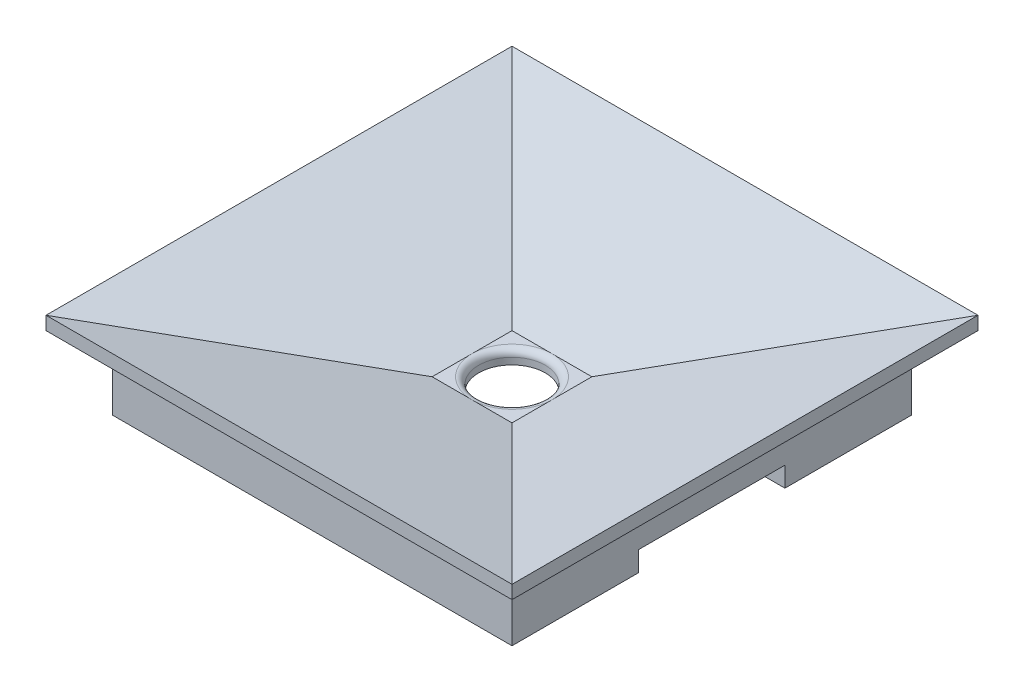
ISO-10303-21;
HEADER;
FILE_DESCRIPTION(('STEP AP214'),'2;1');
FILE_NAME('part.step','',(''),(''),'','','');
FILE_SCHEMA(('AUTOMOTIVE_DESIGN { 1 0 10303 214 1 1 1 1 }'));
ENDSEC;
DATA;
#1=APPLICATION_CONTEXT('core data for automotive mechanical design processes');
#2=APPLICATION_PROTOCOL_DEFINITION('international standard','automotive_design',2000,#1);
#3=PRODUCT_CONTEXT('',#1,'mechanical');
#4=PRODUCT('Part','Part','',(#3));
#5=PRODUCT_RELATED_PRODUCT_CATEGORY('part','',(#4));
#6=PRODUCT_DEFINITION_FORMATION('','',#4);
#7=PRODUCT_DEFINITION_CONTEXT('part definition',#1,'design');
#8=PRODUCT_DEFINITION('design','',#6,#7);
#9=PRODUCT_DEFINITION_SHAPE('','',#8);
#10=(LENGTH_UNIT() NAMED_UNIT(*) SI_UNIT(.MILLI.,.METRE.));
#11=(NAMED_UNIT(*) PLANE_ANGLE_UNIT() SI_UNIT($,.RADIAN.));
#12=(NAMED_UNIT(*) SI_UNIT($,.STERADIAN.) SOLID_ANGLE_UNIT());
#13=UNCERTAINTY_MEASURE_WITH_UNIT(LENGTH_MEASURE(1.E-05),#10,'distance_accuracy_value','');
#14=(GEOMETRIC_REPRESENTATION_CONTEXT(3) GLOBAL_UNCERTAINTY_ASSIGNED_CONTEXT((#13)) GLOBAL_UNIT_ASSIGNED_CONTEXT((#10,
#11,#12)) REPRESENTATION_CONTEXT('',''));
#15=CARTESIAN_POINT('',(0.,0.,0.));
#16=DIRECTION('',(0.,0.,1.));
#17=DIRECTION('',(1.,0.,0.));
#18=AXIS2_PLACEMENT_3D('',#15,#16,#17);
#19=CARTESIAN_POINT('',(0.,5.,0.));
#20=DIRECTION('',(0.,-1.,0.));
#21=DIRECTION('',(0.,0.,-1.));
#22=AXIS2_PLACEMENT_3D('',#19,#20,#21);
#23=PLANE('',#22);
#24=DIRECTION('',(1.,0.,0.));
#25=VECTOR('',#24,1.);
#26=CARTESIAN_POINT('',(0.,5.,-6.));
#27=LINE('',#26,#25);
#28=CARTESIAN_POINT('',(6.,5.,-6.));
#29=VERTEX_POINT('',#28);
#30=CARTESIAN_POINT('',(0.,5.,-6.));
#31=VERTEX_POINT('',#30);
#32=EDGE_CURVE('E345',#29,#31,#27,.F.);
#33=ORIENTED_EDGE('',*,*,#32,.T.);
#34=CARTESIAN_POINT('',(0.,5.,0.));
#35=DIRECTION('',(0.,-1.,0.));
#36=DIRECTION('',(0.,0.,-1.));
#37=AXIS2_PLACEMENT_3D('',#34,#35,#36);
#38=CIRCLE('',#37,6.);
#39=CARTESIAN_POINT('',(6.,5.,0.));
#40=VERTEX_POINT('',#39);
#41=EDGE_CURVE('E60',#31,#40,#38,.T.);
#42=ORIENTED_EDGE('',*,*,#41,.T.);
#43=DIRECTION('',(0.,0.,-1.));
#44=VECTOR('',#43,1.);
#45=CARTESIAN_POINT('',(6.,5.,0.));
#46=LINE('',#45,#44);
#47=EDGE_CURVE('E335',#40,#29,#46,.T.);
#48=ORIENTED_EDGE('',*,*,#47,.T.);
#49=EDGE_LOOP('',(#33,#42,#48));
#50=FACE_BOUND('',#49,.T.);
#51=ADVANCED_FACE('F51',(#50),#23,.F.);
#52=CARTESIAN_POINT('',(6.,5.,6.));
#53=VERTEX_POINT('',#52);
#54=EDGE_CURVE('E331',#53,#40,#46,.T.);
#55=ORIENTED_EDGE('',*,*,#54,.T.);
#56=CARTESIAN_POINT('',(0.,5.,0.));
#57=DIRECTION('',(0.,-1.,0.));
#58=DIRECTION('',(0.,0.,-1.));
#59=AXIS2_PLACEMENT_3D('',#56,#57,#58);
#60=CIRCLE('',#59,6.);
#61=CARTESIAN_POINT('',(0.,5.,6.));
#62=VERTEX_POINT('',#61);
#63=EDGE_CURVE('E67',#40,#62,#60,.T.);
#64=ORIENTED_EDGE('',*,*,#63,.T.);
#65=DIRECTION('',(1.,0.,0.));
#66=VECTOR('',#65,1.);
#67=CARTESIAN_POINT('',(0.,5.,6.));
#68=LINE('',#67,#66);
#69=EDGE_CURVE('E339',#62,#53,#68,.T.);
#70=ORIENTED_EDGE('',*,*,#69,.T.);
#71=EDGE_LOOP('',(#55,#64,#70));
#72=FACE_BOUND('',#71,.T.);
#73=ADVANCED_FACE('F421',(#72),#23,.F.);
#74=CARTESIAN_POINT('',(-6.,5.,6.));
#75=VERTEX_POINT('',#74);
#76=EDGE_CURVE('E336',#75,#62,#68,.T.);
#77=ORIENTED_EDGE('',*,*,#76,.T.);
#78=CARTESIAN_POINT('',(0.,5.,0.));
#79=DIRECTION('',(0.,-1.,0.));
#80=DIRECTION('',(0.,0.,-1.));
#81=AXIS2_PLACEMENT_3D('',#78,#79,#80);
#82=CIRCLE('',#81,6.);
#83=CARTESIAN_POINT('',(-6.,5.,0.));
#84=VERTEX_POINT('',#83);
#85=EDGE_CURVE('E75',#62,#84,#82,.T.);
#86=ORIENTED_EDGE('',*,*,#85,.T.);
#87=DIRECTION('',(0.,0.,-1.));
#88=VECTOR('',#87,1.);
#89=CARTESIAN_POINT('',(-6.,5.,0.));
#90=LINE('',#89,#88);
#91=EDGE_CURVE('E344',#84,#75,#90,.F.);
#92=ORIENTED_EDGE('',*,*,#91,.T.);
#93=EDGE_LOOP('',(#77,#86,#92));
#94=FACE_BOUND('',#93,.T.);
#95=ADVANCED_FACE('F693',(#94),#23,.F.);
#96=CARTESIAN_POINT('',(0.,13.,0.));
#97=DIRECTION('',(0.,-1.,0.));
#98=DIRECTION('',(0.,0.,-1.));
#99=AXIS2_PLACEMENT_3D('',#96,#97,#98);
#100=CYLINDRICAL_SURFACE('',#99,5.);
#101=CARTESIAN_POINT('',(0.,4.,0.));
#102=DIRECTION('',(0.,-1.,0.));
#103=DIRECTION('',(0.,0.,-1.));
#104=AXIS2_PLACEMENT_3D('',#101,#102,#103);
#105=CIRCLE('',#104,5.);
#106=CARTESIAN_POINT('',(0.,4.,-5.));
#107=VERTEX_POINT('',#106);
#108=EDGE_CURVE('E13',#107,#107,#105,.F.);
#109=ORIENTED_EDGE('',*,*,#108,.T.);
#110=EDGE_LOOP('',(#109));
#111=FACE_BOUND('',#110,.T.);
#112=CARTESIAN_POINT('',(0.,3.,0.));
#113=DIRECTION('',(0.,-1.,0.));
#114=DIRECTION('',(0.,0.,-1.));
#115=AXIS2_PLACEMENT_3D('',#112,#113,#114);
#116=CIRCLE('',#115,5.);
#117=CARTESIAN_POINT('',(0.,3.,-5.));
#118=VERTEX_POINT('',#117);
#119=EDGE_CURVE('E492',#118,#118,#116,.F.);
#120=ORIENTED_EDGE('',*,*,#119,.F.);
#121=EDGE_LOOP('',(#120));
#122=FACE_BOUND('',#121,.T.);
#123=ADVANCED_FACE('F710',(#111,#122),#100,.F.);
#124=CARTESIAN_POINT('',(-35.,11.,35.));
#125=DIRECTION('',(-1.,0.,0.));
#126=DIRECTION('',(0.,0.,1.));
#127=AXIS2_PLACEMENT_3D('',#124,#125,#126);
#128=PLANE('',#127);
#129=DIRECTION('',(0.,0.,1.));
#130=VECTOR('',#129,1.);
#131=CARTESIAN_POINT('',(-35.,13.,0.));
#132=LINE('',#131,#130);
#133=CARTESIAN_POINT('',(-35.,13.,-35.));
#134=VERTEX_POINT('',#133);
#135=CARTESIAN_POINT('',(-35.,13.,35.));
#136=VERTEX_POINT('',#135);
#137=EDGE_CURVE('E326',#134,#136,#132,.T.);
#138=ORIENTED_EDGE('',*,*,#137,.F.);
#139=DIRECTION('',(0.,1.,0.));
#140=VECTOR('',#139,1.);
#141=CARTESIAN_POINT('',(-35.,11.,-35.));
#142=LINE('',#141,#140);
#143=CARTESIAN_POINT('',(-35.,11.,-35.));
#144=VERTEX_POINT('',#143);
#145=EDGE_CURVE('E300',#144,#134,#142,.T.);
#146=ORIENTED_EDGE('',*,*,#145,.F.);
#147=DIRECTION('',(0.,0.,1.));
#148=VECTOR('',#147,1.);
#149=CARTESIAN_POINT('',(-35.,11.,35.));
#150=LINE('',#149,#148);
#151=CARTESIAN_POINT('',(-35.,11.,35.));
#152=VERTEX_POINT('',#151);
#153=EDGE_CURVE('E317',#144,#152,#150,.T.);
#154=ORIENTED_EDGE('',*,*,#153,.T.);
#155=DIRECTION('',(0.,1.,0.));
#156=VECTOR('',#155,1.);
#157=CARTESIAN_POINT('',(-35.,11.,35.));
#158=LINE('',#157,#156);
#159=EDGE_CURVE('E305',#152,#136,#158,.T.);
#160=ORIENTED_EDGE('',*,*,#159,.T.);
#161=EDGE_LOOP('',(#138,#146,#154,#160));
#162=FACE_BOUND('',#161,.T.);
#163=ADVANCED_FACE('F714',(#162),#128,.T.);
#164=CARTESIAN_POINT('',(35.,11.,-35.));
#165=DIRECTION('',(0.,0.,-1.));
#166=DIRECTION('',(-1.,0.,0.));
#167=AXIS2_PLACEMENT_3D('',#164,#165,#166);
#168=PLANE('',#167);
#169=DIRECTION('',(1.,0.,0.));
#170=VECTOR('',#169,1.);
#171=CARTESIAN_POINT('',(0.,13.,-35.));
#172=LINE('',#171,#170);
#173=CARTESIAN_POINT('',(35.,13.,-35.));
#174=VERTEX_POINT('',#173);
#175=EDGE_CURVE('E313',#174,#134,#172,.F.);
#176=ORIENTED_EDGE('',*,*,#175,.F.);
#177=DIRECTION('',(0.,1.,0.));
#178=VECTOR('',#177,1.);
#179=CARTESIAN_POINT('',(35.,11.,-35.));
#180=LINE('',#179,#178);
#181=CARTESIAN_POINT('',(35.,11.,-35.));
#182=VERTEX_POINT('',#181);
#183=EDGE_CURVE('E296',#182,#174,#180,.T.);
#184=ORIENTED_EDGE('',*,*,#183,.F.);
#185=DIRECTION('',(-1.,0.,0.));
#186=VECTOR('',#185,1.);
#187=CARTESIAN_POINT('',(35.,11.,-35.));
#188=LINE('',#187,#186);
#189=EDGE_CURVE('E309',#182,#144,#188,.T.);
#190=ORIENTED_EDGE('',*,*,#189,.T.);
#191=ORIENTED_EDGE('',*,*,#145,.T.);
#192=EDGE_LOOP('',(#176,#184,#190,#191));
#193=FACE_BOUND('',#192,.T.);
#194=ADVANCED_FACE('F735',(#193),#168,.T.);
#195=CARTESIAN_POINT('',(35.,11.,35.));
#196=DIRECTION('',(1.,0.,0.));
#197=DIRECTION('',(0.,0.,-1.));
#198=AXIS2_PLACEMENT_3D('',#195,#196,#197);
#199=PLANE('',#198);
#200=DIRECTION('',(0.,0.,1.));
#201=VECTOR('',#200,1.);
#202=CARTESIAN_POINT('',(35.,13.,0.));
#203=LINE('',#202,#201);
#204=CARTESIAN_POINT('',(35.,13.,35.));
#205=VERTEX_POINT('',#204);
#206=EDGE_CURVE('E318',#205,#174,#203,.F.);
#207=ORIENTED_EDGE('',*,*,#206,.F.);
#208=DIRECTION('',(0.,1.,0.));
#209=VECTOR('',#208,1.);
#210=CARTESIAN_POINT('',(35.,11.,35.));
#211=LINE('',#210,#209);
#212=CARTESIAN_POINT('',(35.,11.,35.));
#213=VERTEX_POINT('',#212);
#214=EDGE_CURVE('E301',#213,#205,#211,.T.);
#215=ORIENTED_EDGE('',*,*,#214,.F.);
#216=DIRECTION('',(0.,0.,-1.));
#217=VECTOR('',#216,1.);
#218=CARTESIAN_POINT('',(35.,11.,35.));
#219=LINE('',#218,#217);
#220=EDGE_CURVE('E592',#213,#182,#219,.T.);
#221=ORIENTED_EDGE('',*,*,#220,.T.);
#222=ORIENTED_EDGE('',*,*,#183,.T.);
#223=EDGE_LOOP('',(#207,#215,#221,#222));
#224=FACE_BOUND('',#223,.T.);
#225=ADVANCED_FACE('F732',(#224),#199,.T.);
#226=CARTESIAN_POINT('',(35.,11.,35.));
#227=DIRECTION('',(0.,0.,1.));
#228=DIRECTION('',(1.,0.,0.));
#229=AXIS2_PLACEMENT_3D('',#226,#227,#228);
#230=PLANE('',#229);
#231=DIRECTION('',(1.,0.,0.));
#232=VECTOR('',#231,1.);
#233=CARTESIAN_POINT('',(0.,13.,35.));
#234=LINE('',#233,#232);
#235=EDGE_CURVE('E322',#136,#205,#234,.T.);
#236=ORIENTED_EDGE('',*,*,#235,.F.);
#237=ORIENTED_EDGE('',*,*,#159,.F.);
#238=DIRECTION('',(1.,0.,0.));
#239=VECTOR('',#238,1.);
#240=CARTESIAN_POINT('',(35.,11.,35.));
#241=LINE('',#240,#239);
#242=EDGE_CURVE('E588',#152,#213,#241,.T.);
#243=ORIENTED_EDGE('',*,*,#242,.T.);
#244=ORIENTED_EDGE('',*,*,#214,.T.);
#245=EDGE_LOOP('',(#236,#237,#243,#244));
#246=FACE_BOUND('',#245,.T.);
#247=ADVANCED_FACE('F728',(#246),#230,.T.);
#248=CARTESIAN_POINT('',(0.,11.,0.));
#249=DIRECTION('',(0.,1.,0.));
#250=DIRECTION('',(0.,0.,1.));
#251=AXIS2_PLACEMENT_3D('',#248,#249,#250);
#252=PLANE('',#251);
#253=DIRECTION('',(1.,0.,0.));
#254=VECTOR('',#253,1.);
#255=CARTESIAN_POINT('',(-30.,11.,30.));
#256=LINE('',#255,#254);
#257=CARTESIAN_POINT('',(-30.,11.,30.));
#258=VERTEX_POINT('',#257);
#259=CARTESIAN_POINT('',(30.,11.,30.));
#260=VERTEX_POINT('',#259);
#261=EDGE_CURVE('E330',#258,#260,#256,.T.);
#262=ORIENTED_EDGE('',*,*,#261,.T.);
#263=DIRECTION('',(0.,0.,-1.));
#264=VECTOR('',#263,1.);
#265=CARTESIAN_POINT('',(30.,11.,30.));
#266=LINE('',#265,#264);
#267=CARTESIAN_POINT('',(30.,11.,-30.));
#268=VERTEX_POINT('',#267);
#269=EDGE_CURVE('E334',#260,#268,#266,.T.);
#270=ORIENTED_EDGE('',*,*,#269,.T.);
#271=DIRECTION('',(-1.,0.,0.));
#272=VECTOR('',#271,1.);
#273=CARTESIAN_POINT('',(30.,11.,-30.));
#274=LINE('',#273,#272);
#275=CARTESIAN_POINT('',(-30.,11.,-30.));
#276=VERTEX_POINT('',#275);
#277=EDGE_CURVE('E577',#268,#276,#274,.T.);
#278=ORIENTED_EDGE('',*,*,#277,.T.);
#279=DIRECTION('',(0.,0.,1.));
#280=VECTOR('',#279,1.);
#281=CARTESIAN_POINT('',(-30.,11.,-30.));
#282=LINE('',#281,#280);
#283=EDGE_CURVE('E580',#276,#258,#282,.T.);
#284=ORIENTED_EDGE('',*,*,#283,.T.);
#285=EDGE_LOOP('',(#262,#270,#278,#284));
#286=FACE_BOUND('',#285,.T.);
#287=ORIENTED_EDGE('',*,*,#153,.F.);
#288=ORIENTED_EDGE('',*,*,#189,.F.);
#289=ORIENTED_EDGE('',*,*,#220,.F.);
#290=ORIENTED_EDGE('',*,*,#242,.F.);
#291=EDGE_LOOP('',(#287,#288,#289,#290));
#292=FACE_BOUND('',#291,.T.);
#293=ADVANCED_FACE('F739',(#286,#292),#252,.F.);
#294=CARTESIAN_POINT('',(0.,0.,0.));
#295=DIRECTION('',(0.,-1.,0.));
#296=DIRECTION('',(0.,0.,-1.));
#297=AXIS2_PLACEMENT_3D('',#294,#295,#296);
#298=PLANE('',#297);
#299=DIRECTION('',(-1.,0.,0.));
#300=VECTOR('',#299,1.);
#301=CARTESIAN_POINT('',(0.,0.,-11.));
#302=LINE('',#301,#300);
#303=CARTESIAN_POINT('',(30.,0.,-11.));
#304=VERTEX_POINT('',#303);
#305=CARTESIAN_POINT('',(15.,0.,-11.));
#306=VERTEX_POINT('',#305);
#307=EDGE_CURVE('E239',#304,#306,#302,.T.);
#308=ORIENTED_EDGE('',*,*,#307,.T.);
#309=CARTESIAN_POINT('',(15.,0.,-15.));
#310=DIRECTION('',(0.,-1.,0.));
#311=DIRECTION('',(0.,0.,-1.));
#312=AXIS2_PLACEMENT_3D('',#309,#310,#311);
#313=CIRCLE('',#312,4.);
#314=CARTESIAN_POINT('',(11.,0.,-15.));
#315=VERTEX_POINT('',#314);
#316=EDGE_CURVE('E361',#306,#315,#313,.T.);
#317=ORIENTED_EDGE('',*,*,#316,.T.);
#318=DIRECTION('',(0.,0.,1.));
#319=VECTOR('',#318,1.);
#320=CARTESIAN_POINT('',(11.,0.,0.));
#321=LINE('',#320,#319);
#322=CARTESIAN_POINT('',(11.,0.,-15.335));
#323=VERTEX_POINT('',#322);
#324=EDGE_CURVE('E251',#323,#315,#321,.T.);
#325=ORIENTED_EDGE('',*,*,#324,.F.);
#326=DIRECTION('',(-1.,0.,0.));
#327=VECTOR('',#326,1.);
#328=CARTESIAN_POINT('',(0.,0.,-15.335));
#329=LINE('',#328,#327);
#330=CARTESIAN_POINT('',(-11.,0.,-15.335));
#331=VERTEX_POINT('',#330);
#332=EDGE_CURVE('E534',#323,#331,#329,.T.);
#333=ORIENTED_EDGE('',*,*,#332,.T.);
#334=DIRECTION('',(0.,0.,1.));
#335=VECTOR('',#334,1.);
#336=CARTESIAN_POINT('',(-11.,0.,0.));
#337=LINE('',#336,#335);
#338=CARTESIAN_POINT('',(-11.,0.,-15.));
#339=VERTEX_POINT('',#338);
#340=EDGE_CURVE('E538',#331,#339,#337,.T.);
#341=ORIENTED_EDGE('',*,*,#340,.T.);
#342=CARTESIAN_POINT('',(-15.,0.,-15.));
#343=DIRECTION('',(0.,-1.,0.));
#344=DIRECTION('',(0.,0.,-1.));
#345=AXIS2_PLACEMENT_3D('',#342,#343,#344);
#346=CIRCLE('',#345,4.);
#347=CARTESIAN_POINT('',(-15.,0.,-11.));
#348=VERTEX_POINT('',#347);
#349=EDGE_CURVE('E352',#339,#348,#346,.T.);
#350=ORIENTED_EDGE('',*,*,#349,.T.);
#351=DIRECTION('',(-1.,0.,0.));
#352=VECTOR('',#351,1.);
#353=CARTESIAN_POINT('',(0.,0.,-11.));
#354=LINE('',#353,#352);
#355=CARTESIAN_POINT('',(-15.335,0.,-11.));
#356=VERTEX_POINT('',#355);
#357=EDGE_CURVE('E542',#348,#356,#354,.T.);
#358=ORIENTED_EDGE('',*,*,#357,.T.);
#359=DIRECTION('',(0.,0.,1.));
#360=VECTOR('',#359,1.);
#361=CARTESIAN_POINT('',(-15.335,0.,0.));
#362=LINE('',#361,#360);
#363=CARTESIAN_POINT('',(-15.335,0.,11.));
#364=VERTEX_POINT('',#363);
#365=EDGE_CURVE('E545',#356,#364,#362,.T.);
#366=ORIENTED_EDGE('',*,*,#365,.T.);
#367=DIRECTION('',(-1.,0.,0.));
#368=VECTOR('',#367,1.);
#369=CARTESIAN_POINT('',(0.,0.,11.));
#370=LINE('',#369,#368);
#371=CARTESIAN_POINT('',(-15.,0.,11.));
#372=VERTEX_POINT('',#371);
#373=EDGE_CURVE('E549',#372,#364,#370,.T.);
#374=ORIENTED_EDGE('',*,*,#373,.F.);
#375=CARTESIAN_POINT('',(-15.,0.,15.));
#376=DIRECTION('',(0.,-1.,0.));
#377=DIRECTION('',(0.,0.,-1.));
#378=AXIS2_PLACEMENT_3D('',#375,#376,#377);
#379=CIRCLE('',#378,4.);
#380=CARTESIAN_POINT('',(-11.,0.,15.));
#381=VERTEX_POINT('',#380);
#382=EDGE_CURVE('E355',#372,#381,#379,.T.);
#383=ORIENTED_EDGE('',*,*,#382,.T.);
#384=DIRECTION('',(0.,0.,1.));
#385=VECTOR('',#384,1.);
#386=CARTESIAN_POINT('',(-11.,0.,0.));
#387=LINE('',#386,#385);
#388=CARTESIAN_POINT('',(-11.,0.,15.335));
#389=VERTEX_POINT('',#388);
#390=EDGE_CURVE('E552',#381,#389,#387,.T.);
#391=ORIENTED_EDGE('',*,*,#390,.T.);
#392=DIRECTION('',(-1.,0.,0.));
#393=VECTOR('',#392,1.);
#394=CARTESIAN_POINT('',(0.,0.,15.335));
#395=LINE('',#394,#393);
#396=CARTESIAN_POINT('',(11.,0.,15.335));
#397=VERTEX_POINT('',#396);
#398=EDGE_CURVE('E555',#397,#389,#395,.T.);
#399=ORIENTED_EDGE('',*,*,#398,.F.);
#400=DIRECTION('',(0.,0.,1.));
#401=VECTOR('',#400,1.);
#402=CARTESIAN_POINT('',(11.,0.,0.));
#403=LINE('',#402,#401);
#404=CARTESIAN_POINT('',(11.,0.,15.));
#405=VERTEX_POINT('',#404);
#406=EDGE_CURVE('E559',#405,#397,#403,.T.);
#407=ORIENTED_EDGE('',*,*,#406,.F.);
#408=CARTESIAN_POINT('',(15.,0.,15.));
#409=DIRECTION('',(0.,-1.,0.));
#410=DIRECTION('',(0.,0.,-1.));
#411=AXIS2_PLACEMENT_3D('',#408,#409,#410);
#412=CIRCLE('',#411,4.);
#413=CARTESIAN_POINT('',(15.,0.,11.));
#414=VERTEX_POINT('',#413);
#415=EDGE_CURVE('E358',#405,#414,#412,.T.);
#416=ORIENTED_EDGE('',*,*,#415,.T.);
#417=DIRECTION('',(-1.,0.,0.));
#418=VECTOR('',#417,1.);
#419=CARTESIAN_POINT('',(0.,0.,11.));
#420=LINE('',#419,#418);
#421=CARTESIAN_POINT('',(30.,0.,11.));
#422=VERTEX_POINT('',#421);
#423=EDGE_CURVE('E250',#422,#414,#420,.T.);
#424=ORIENTED_EDGE('',*,*,#423,.F.);
#425=DIRECTION('',(0.,0.,-1.));
#426=VECTOR('',#425,1.);
#427=CARTESIAN_POINT('',(30.,0.,30.));
#428=LINE('',#427,#426);
#429=CARTESIAN_POINT('',(30.,0.,30.));
#430=VERTEX_POINT('',#429);
#431=EDGE_CURVE('E272',#430,#422,#428,.T.);
#432=ORIENTED_EDGE('',*,*,#431,.F.);
#433=DIRECTION('',(1.,0.,0.));
#434=VECTOR('',#433,1.);
#435=CARTESIAN_POINT('',(-30.,0.,30.));
#436=LINE('',#435,#434);
#437=CARTESIAN_POINT('',(-30.,0.,30.));
#438=VERTEX_POINT('',#437);
#439=EDGE_CURVE('E276',#438,#430,#436,.T.);
#440=ORIENTED_EDGE('',*,*,#439,.F.);
#441=DIRECTION('',(0.,0.,-1.));
#442=VECTOR('',#441,1.);
#443=CARTESIAN_POINT('',(-30.,0.,30.));
#444=LINE('',#443,#442);
#445=CARTESIAN_POINT('',(-30.,0.,-30.));
#446=VERTEX_POINT('',#445);
#447=EDGE_CURVE('E277',#438,#446,#444,.T.);
#448=ORIENTED_EDGE('',*,*,#447,.T.);
#449=DIRECTION('',(1.,0.,0.));
#450=VECTOR('',#449,1.);
#451=CARTESIAN_POINT('',(-30.,0.,-30.));
#452=LINE('',#451,#450);
#453=CARTESIAN_POINT('',(30.,0.,-30.));
#454=VERTEX_POINT('',#453);
#455=EDGE_CURVE('E270',#446,#454,#452,.T.);
#456=ORIENTED_EDGE('',*,*,#455,.T.);
#457=EDGE_CURVE('E257',#304,#454,#428,.T.);
#458=ORIENTED_EDGE('',*,*,#457,.F.);
#459=EDGE_LOOP('',(#308,#317,#325,#333,#341,#350,#358,#366,#374,#383,#391,#399,#407,#416,#424,
#432,#440,#448,#456,#458));
#460=FACE_BOUND('',#459,.T.);
#461=CARTESIAN_POINT('',(-14.,0.,13.335));
#462=DIRECTION('',(0.,-1.,0.));
#463=DIRECTION('',(0.,0.,-1.));
#464=AXIS2_PLACEMENT_3D('',#461,#462,#463);
#465=CIRCLE('',#464,0.925000000000001);
#466=CARTESIAN_POINT('',(-14.,0.,12.41));
#467=VERTEX_POINT('',#466);
#468=EDGE_CURVE('E466',#467,#467,#465,.T.);
#469=ORIENTED_EDGE('',*,*,#468,.F.);
#470=EDGE_LOOP('',(#469));
#471=FACE_BOUND('',#470,.T.);
#472=CARTESIAN_POINT('',(14.,0.,13.335));
#473=DIRECTION('',(0.,-1.,0.));
#474=DIRECTION('',(0.,0.,-1.));
#475=AXIS2_PLACEMENT_3D('',#472,#473,#474);
#476=CIRCLE('',#475,0.925000000000001);
#477=CARTESIAN_POINT('',(14.,0.,12.41));
#478=VERTEX_POINT('',#477);
#479=EDGE_CURVE('E458',#478,#478,#476,.T.);
#480=ORIENTED_EDGE('',*,*,#479,.F.);
#481=EDGE_LOOP('',(#480));
#482=FACE_BOUND('',#481,.T.);
#483=CARTESIAN_POINT('',(14.,0.,-13.335));
#484=DIRECTION('',(0.,-1.,0.));
#485=DIRECTION('',(0.,0.,-1.));
#486=AXIS2_PLACEMENT_3D('',#483,#484,#485);
#487=CIRCLE('',#486,0.925000000000001);
#488=CARTESIAN_POINT('',(14.,0.,-14.26));
#489=VERTEX_POINT('',#488);
#490=EDGE_CURVE('E450',#489,#489,#487,.T.);
#491=ORIENTED_EDGE('',*,*,#490,.F.);
#492=EDGE_LOOP('',(#491));
#493=FACE_BOUND('',#492,.T.);
#494=CARTESIAN_POINT('',(-14.,0.,-13.335));
#495=DIRECTION('',(0.,-1.,0.));
#496=DIRECTION('',(0.,0.,-1.));
#497=AXIS2_PLACEMENT_3D('',#494,#495,#496);
#498=CIRCLE('',#497,0.925000000000001);
#499=CARTESIAN_POINT('',(-14.,0.,-14.26));
#500=VERTEX_POINT('',#499);
#501=EDGE_CURVE('E442',#500,#500,#498,.T.);
#502=ORIENTED_EDGE('',*,*,#501,.F.);
#503=EDGE_LOOP('',(#502));
#504=FACE_BOUND('',#503,.T.);
#505=ADVANCED_FACE('F266',(#460,#471,#482,#493,#504),#298,.T.);
#506=CARTESIAN_POINT('',(-30.,6.,-30.));
#507=DIRECTION('',(0.,0.,-1.));
#508=DIRECTION('',(-1.,0.,0.));
#509=AXIS2_PLACEMENT_3D('',#506,#507,#508);
#510=PLANE('',#509);
#511=DIRECTION('',(0.,-1.,0.));
#512=VECTOR('',#511,1.);
#513=CARTESIAN_POINT('',(-30.,6.,-30.));
#514=LINE('',#513,#512);
#515=EDGE_CURVE('E284',#276,#446,#514,.T.);
#516=ORIENTED_EDGE('',*,*,#515,.F.);
#517=ORIENTED_EDGE('',*,*,#277,.F.);
#518=DIRECTION('',(0.,-1.,0.));
#519=VECTOR('',#518,1.);
#520=CARTESIAN_POINT('',(30.,6.,-30.));
#521=LINE('',#520,#519);
#522=EDGE_CURVE('E291',#268,#454,#521,.T.);
#523=ORIENTED_EDGE('',*,*,#522,.T.);
#524=ORIENTED_EDGE('',*,*,#455,.F.);
#525=EDGE_LOOP('',(#516,#517,#523,#524));
#526=FACE_BOUND('',#525,.T.);
#527=ADVANCED_FACE('F609',(#526),#510,.T.);
#528=CARTESIAN_POINT('',(30.,6.,30.));
#529=DIRECTION('',(-1.,0.,0.));
#530=DIRECTION('',(0.,0.,1.));
#531=AXIS2_PLACEMENT_3D('',#528,#529,#530);
#532=PLANE('',#531);
#533=ORIENTED_EDGE('',*,*,#431,.T.);
#534=DIRECTION('',(0.,-1.,0.));
#535=VECTOR('',#534,1.);
#536=CARTESIAN_POINT('',(30.,29.4397848894427,11.));
#537=LINE('',#536,#535);
#538=CARTESIAN_POINT('',(30.,3.,11.));
#539=VERTEX_POINT('',#538);
#540=EDGE_CURVE('E263',#539,#422,#537,.T.);
#541=ORIENTED_EDGE('',*,*,#540,.F.);
#542=DIRECTION('',(0.,0.,-1.));
#543=VECTOR('',#542,1.);
#544=CARTESIAN_POINT('',(30.,3.,-11.));
#545=LINE('',#544,#543);
#546=CARTESIAN_POINT('',(30.,3.,-11.));
#547=VERTEX_POINT('',#546);
#548=EDGE_CURVE('E261',#539,#547,#545,.T.);
#549=ORIENTED_EDGE('',*,*,#548,.T.);
#550=DIRECTION('',(0.,-1.,0.));
#551=VECTOR('',#550,1.);
#552=CARTESIAN_POINT('',(30.,29.4397848894427,-11.));
#553=LINE('',#552,#551);
#554=EDGE_CURVE('E243',#547,#304,#553,.T.);
#555=ORIENTED_EDGE('',*,*,#554,.T.);
#556=ORIENTED_EDGE('',*,*,#457,.T.);
#557=ORIENTED_EDGE('',*,*,#522,.F.);
#558=ORIENTED_EDGE('',*,*,#269,.F.);
#559=DIRECTION('',(0.,-1.,0.));
#560=VECTOR('',#559,1.);
#561=CARTESIAN_POINT('',(30.,6.,30.));
#562=LINE('',#561,#560);
#563=EDGE_CURVE('E288',#260,#430,#562,.T.);
#564=ORIENTED_EDGE('',*,*,#563,.T.);
#565=EDGE_LOOP('',(#533,#541,#549,#555,#556,#557,#558,#564));
#566=FACE_BOUND('',#565,.T.);
#567=ADVANCED_FACE('F255',(#566),#532,.F.);
#568=CARTESIAN_POINT('',(-30.,6.,30.));
#569=DIRECTION('',(0.,0.,-1.));
#570=DIRECTION('',(-1.,0.,0.));
#571=AXIS2_PLACEMENT_3D('',#568,#569,#570);
#572=PLANE('',#571);
#573=ORIENTED_EDGE('',*,*,#261,.F.);
#574=DIRECTION('',(0.,-1.,0.));
#575=VECTOR('',#574,1.);
#576=CARTESIAN_POINT('',(-30.,6.,30.));
#577=LINE('',#576,#575);
#578=EDGE_CURVE('E285',#258,#438,#577,.T.);
#579=ORIENTED_EDGE('',*,*,#578,.T.);
#580=ORIENTED_EDGE('',*,*,#439,.T.);
#581=ORIENTED_EDGE('',*,*,#563,.F.);
#582=EDGE_LOOP('',(#573,#579,#580,#581));
#583=FACE_BOUND('',#582,.T.);
#584=ADVANCED_FACE('F615',(#583),#572,.F.);
#585=CARTESIAN_POINT('',(-30.,6.,30.));
#586=DIRECTION('',(-1.,0.,0.));
#587=DIRECTION('',(0.,0.,1.));
#588=AXIS2_PLACEMENT_3D('',#585,#586,#587);
#589=PLANE('',#588);
#590=ORIENTED_EDGE('',*,*,#578,.F.);
#591=ORIENTED_EDGE('',*,*,#283,.F.);
#592=ORIENTED_EDGE('',*,*,#515,.T.);
#593=ORIENTED_EDGE('',*,*,#447,.F.);
#594=EDGE_LOOP('',(#590,#591,#592,#593));
#595=FACE_BOUND('',#594,.T.);
#596=ADVANCED_FACE('F604',(#595),#589,.T.);
#597=CARTESIAN_POINT('',(-0.857458563535912,3.10828729281768,0.));
#598=DIRECTION('',(0.265928998125813,-0.963992618206074,0.));
#599=DIRECTION('',(0.963992618206074,0.265928998125813,0.));
#600=AXIS2_PLACEMENT_3D('',#597,#598,#599);
#601=PLANE('',#600);
#602=DIRECTION('',(0.694026219997147,0.19145550896473,-0.694026219997147));
#603=VECTOR('',#602,1.);
#604=CARTESIAN_POINT('',(6.,5.,-6.));
#605=LINE('',#604,#603);
#606=EDGE_CURVE('E419',#29,#174,#605,.T.);
#607=ORIENTED_EDGE('',*,*,#606,.F.);
#608=ORIENTED_EDGE('',*,*,#47,.F.);
#609=ORIENTED_EDGE('',*,*,#54,.F.);
#610=DIRECTION('',(0.694026219997147,0.19145550896473,0.694026219997147));
#611=VECTOR('',#610,1.);
#612=CARTESIAN_POINT('',(6.,5.,6.));
#613=LINE('',#612,#611);
#614=EDGE_CURVE('E433',#53,#205,#613,.T.);
#615=ORIENTED_EDGE('',*,*,#614,.T.);
#616=ORIENTED_EDGE('',*,*,#206,.T.);
#617=EDGE_LOOP('',(#607,#608,#609,#615,#616));
#618=FACE_BOUND('',#617,.T.);
#619=ADVANCED_FACE('F417',(#618),#601,.F.);
#620=CARTESIAN_POINT('',(0.,3.10828729281768,-0.857458563535912));
#621=DIRECTION('',(0.,-0.963992618206074,0.265928998125813));
#622=DIRECTION('',(0.,-0.265928998125814,-0.963992618206074));
#623=AXIS2_PLACEMENT_3D('',#620,#621,#622);
#624=PLANE('',#623);
#625=ORIENTED_EDGE('',*,*,#614,.F.);
#626=ORIENTED_EDGE('',*,*,#69,.F.);
#627=ORIENTED_EDGE('',*,*,#76,.F.);
#628=DIRECTION('',(-0.694026219997147,0.19145550896473,0.694026219997147));
#629=VECTOR('',#628,1.);
#630=CARTESIAN_POINT('',(-6.,5.,6.));
#631=LINE('',#630,#629);
#632=EDGE_CURVE('E428',#75,#136,#631,.T.);
#633=ORIENTED_EDGE('',*,*,#632,.T.);
#634=ORIENTED_EDGE('',*,*,#235,.T.);
#635=EDGE_LOOP('',(#625,#626,#627,#633,#634));
#636=FACE_BOUND('',#635,.T.);
#637=ADVANCED_FACE('F724',(#636),#624,.F.);
#638=CARTESIAN_POINT('',(0.,3.10828729281768,0.857458563535912));
#639=DIRECTION('',(0.,-0.963992618206074,-0.265928998125813));
#640=DIRECTION('',(0.,0.265928998125814,-0.963992618206074));
#641=AXIS2_PLACEMENT_3D('',#638,#639,#640);
#642=PLANE('',#641);
#643=DIRECTION('',(-0.694026219997147,0.19145550896473,-0.694026219997147));
#644=VECTOR('',#643,1.);
#645=CARTESIAN_POINT('',(-6.,5.,-6.));
#646=LINE('',#645,#644);
#647=CARTESIAN_POINT('',(-6.,5.,-6.));
#648=VERTEX_POINT('',#647);
#649=EDGE_CURVE('E430',#648,#134,#646,.T.);
#650=ORIENTED_EDGE('',*,*,#649,.F.);
#651=EDGE_CURVE('E349',#31,#648,#27,.F.);
#652=ORIENTED_EDGE('',*,*,#651,.F.);
#653=ORIENTED_EDGE('',*,*,#32,.F.);
#654=ORIENTED_EDGE('',*,*,#606,.T.);
#655=ORIENTED_EDGE('',*,*,#175,.T.);
#656=EDGE_LOOP('',(#650,#652,#653,#654,#655));
#657=FACE_BOUND('',#656,.T.);
#658=ADVANCED_FACE('F707',(#657),#642,.F.);
#659=CARTESIAN_POINT('',(0.857458563535912,3.10828729281768,0.));
#660=DIRECTION('',(-0.265928998125813,-0.963992618206074,0.));
#661=DIRECTION('',(0.963992618206074,-0.265928998125813,0.));
#662=AXIS2_PLACEMENT_3D('',#659,#660,#661);
#663=PLANE('',#662);
#664=ORIENTED_EDGE('',*,*,#632,.F.);
#665=ORIENTED_EDGE('',*,*,#91,.F.);
#666=EDGE_CURVE('E340',#648,#84,#90,.F.);
#667=ORIENTED_EDGE('',*,*,#666,.F.);
#668=ORIENTED_EDGE('',*,*,#649,.T.);
#669=ORIENTED_EDGE('',*,*,#137,.T.);
#670=EDGE_LOOP('',(#664,#665,#667,#668,#669));
#671=FACE_BOUND('',#670,.T.);
#672=ADVANCED_FACE('F698',(#671),#663,.F.);
#673=ORIENTED_EDGE('',*,*,#666,.T.);
#674=CARTESIAN_POINT('',(0.,5.,0.));
#675=DIRECTION('',(0.,-1.,0.));
#676=DIRECTION('',(0.,0.,-1.));
#677=AXIS2_PLACEMENT_3D('',#674,#675,#676);
#678=CIRCLE('',#677,6.);
#679=EDGE_CURVE('E400',#84,#31,#678,.T.);
#680=ORIENTED_EDGE('',*,*,#679,.T.);
#681=ORIENTED_EDGE('',*,*,#651,.T.);
#682=EDGE_LOOP('',(#673,#680,#681));
#683=FACE_BOUND('',#682,.T.);
#684=ADVANCED_FACE('F689',(#683),#23,.F.);
#685=CARTESIAN_POINT('',(-14.,3.,-13.335));
#686=DIRECTION('',(0.,-1.,0.));
#687=DIRECTION('',(0.,0.,-1.));
#688=AXIS2_PLACEMENT_3D('',#685,#686,#687);
#689=CYLINDRICAL_SURFACE('',#688,0.925000000000001);
#690=CARTESIAN_POINT('',(-14.,3.,-13.335));
#691=DIRECTION('',(0.,-1.,0.));
#692=DIRECTION('',(0.,0.,-1.));
#693=AXIS2_PLACEMENT_3D('',#690,#691,#692);
#694=CIRCLE('',#693,0.925000000000001);
#695=CARTESIAN_POINT('',(-14.,3.,-14.26));
#696=VERTEX_POINT('',#695);
#697=EDGE_CURVE('E438',#696,#696,#694,.T.);
#698=ORIENTED_EDGE('',*,*,#697,.F.);
#699=EDGE_LOOP('',(#698));
#700=FACE_BOUND('',#699,.T.);
#701=ORIENTED_EDGE('',*,*,#501,.T.);
#702=EDGE_LOOP('',(#701));
#703=FACE_BOUND('',#702,.T.);
#704=ADVANCED_FACE('F697',(#700,#703),#689,.F.);
#705=CARTESIAN_POINT('',(-14.,3.,-13.335));
#706=DIRECTION('',(0.,-1.,0.));
#707=DIRECTION('',(0.,0.,-1.));
#708=AXIS2_PLACEMENT_3D('',#705,#706,#707);
#709=PLANE('',#708);
#710=ORIENTED_EDGE('',*,*,#697,.T.);
#711=EDGE_LOOP('',(#710));
#712=FACE_BOUND('',#711,.T.);
#713=ADVANCED_FACE('F704',(#712),#709,.T.);
#714=CARTESIAN_POINT('',(14.,3.,-13.335));
#715=DIRECTION('',(0.,-1.,0.));
#716=DIRECTION('',(0.,0.,-1.));
#717=AXIS2_PLACEMENT_3D('',#714,#715,#716);
#718=CYLINDRICAL_SURFACE('',#717,0.925000000000001);
#719=CARTESIAN_POINT('',(14.,3.,-13.335));
#720=DIRECTION('',(0.,-1.,0.));
#721=DIRECTION('',(0.,0.,-1.));
#722=AXIS2_PLACEMENT_3D('',#719,#720,#721);
#723=CIRCLE('',#722,0.925000000000001);
#724=CARTESIAN_POINT('',(14.,3.,-14.26));
#725=VERTEX_POINT('',#724);
#726=EDGE_CURVE('E446',#725,#725,#723,.T.);
#727=ORIENTED_EDGE('',*,*,#726,.F.);
#728=EDGE_LOOP('',(#727));
#729=FACE_BOUND('',#728,.T.);
#730=ORIENTED_EDGE('',*,*,#490,.T.);
#731=EDGE_LOOP('',(#730));
#732=FACE_BOUND('',#731,.T.);
#733=ADVANCED_FACE('F980',(#729,#732),#718,.F.);
#734=CARTESIAN_POINT('',(14.,3.,-13.335));
#735=DIRECTION('',(0.,-1.,0.));
#736=DIRECTION('',(0.,0.,-1.));
#737=AXIS2_PLACEMENT_3D('',#734,#735,#736);
#738=PLANE('',#737);
#739=ORIENTED_EDGE('',*,*,#726,.T.);
#740=EDGE_LOOP('',(#739));
#741=FACE_BOUND('',#740,.T.);
#742=ADVANCED_FACE('F970',(#741),#738,.T.);
#743=CARTESIAN_POINT('',(14.,3.,13.335));
#744=DIRECTION('',(0.,-1.,0.));
#745=DIRECTION('',(0.,0.,-1.));
#746=AXIS2_PLACEMENT_3D('',#743,#744,#745);
#747=CYLINDRICAL_SURFACE('',#746,0.925000000000001);
#748=CARTESIAN_POINT('',(14.,3.,13.335));
#749=DIRECTION('',(0.,-1.,0.));
#750=DIRECTION('',(0.,0.,-1.));
#751=AXIS2_PLACEMENT_3D('',#748,#749,#750);
#752=CIRCLE('',#751,0.925000000000001);
#753=CARTESIAN_POINT('',(14.,3.,12.41));
#754=VERTEX_POINT('',#753);
#755=EDGE_CURVE('E454',#754,#754,#752,.T.);
#756=ORIENTED_EDGE('',*,*,#755,.F.);
#757=EDGE_LOOP('',(#756));
#758=FACE_BOUND('',#757,.T.);
#759=ORIENTED_EDGE('',*,*,#479,.T.);
#760=EDGE_LOOP('',(#759));
#761=FACE_BOUND('',#760,.T.);
#762=ADVANCED_FACE('F960',(#758,#761),#747,.F.);
#763=CARTESIAN_POINT('',(14.,3.,13.335));
#764=DIRECTION('',(0.,-1.,0.));
#765=DIRECTION('',(0.,0.,-1.));
#766=AXIS2_PLACEMENT_3D('',#763,#764,#765);
#767=PLANE('',#766);
#768=ORIENTED_EDGE('',*,*,#755,.T.);
#769=EDGE_LOOP('',(#768));
#770=FACE_BOUND('',#769,.T.);
#771=ADVANCED_FACE('F950',(#770),#767,.T.);
#772=CARTESIAN_POINT('',(-14.,3.,13.335));
#773=DIRECTION('',(0.,-1.,0.));
#774=DIRECTION('',(0.,0.,-1.));
#775=AXIS2_PLACEMENT_3D('',#772,#773,#774);
#776=CYLINDRICAL_SURFACE('',#775,0.925000000000001);
#777=CARTESIAN_POINT('',(-14.,3.,13.335));
#778=DIRECTION('',(0.,-1.,0.));
#779=DIRECTION('',(0.,0.,-1.));
#780=AXIS2_PLACEMENT_3D('',#777,#778,#779);
#781=CIRCLE('',#780,0.925000000000001);
#782=CARTESIAN_POINT('',(-14.,3.,12.41));
#783=VERTEX_POINT('',#782);
#784=EDGE_CURVE('E462',#783,#783,#781,.T.);
#785=ORIENTED_EDGE('',*,*,#784,.F.);
#786=EDGE_LOOP('',(#785));
#787=FACE_BOUND('',#786,.T.);
#788=ORIENTED_EDGE('',*,*,#468,.T.);
#789=EDGE_LOOP('',(#788));
#790=FACE_BOUND('',#789,.T.);
#791=ADVANCED_FACE('F940',(#787,#790),#776,.F.);
#792=CARTESIAN_POINT('',(-14.,3.,13.335));
#793=DIRECTION('',(0.,-1.,0.));
#794=DIRECTION('',(0.,0.,-1.));
#795=AXIS2_PLACEMENT_3D('',#792,#793,#794);
#796=PLANE('',#795);
#797=ORIENTED_EDGE('',*,*,#784,.T.);
#798=EDGE_LOOP('',(#797));
#799=FACE_BOUND('',#798,.T.);
#800=ADVANCED_FACE('F897',(#799),#796,.T.);
#801=CARTESIAN_POINT('',(11.,3.,0.));
#802=DIRECTION('',(1.,0.,0.));
#803=DIRECTION('',(0.,0.,-1.));
#804=AXIS2_PLACEMENT_3D('',#801,#802,#803);
#805=PLANE('',#804);
#806=ORIENTED_EDGE('',*,*,#324,.T.);
#807=DIRECTION('',(0.,-1.,0.));
#808=VECTOR('',#807,1.);
#809=CARTESIAN_POINT('',(11.,3.,-15.));
#810=LINE('',#809,#808);
#811=CARTESIAN_POINT('',(11.,3.,-15.));
#812=VERTEX_POINT('',#811);
#813=EDGE_CURVE('E364',#315,#812,#810,.F.);
#814=ORIENTED_EDGE('',*,*,#813,.T.);
#815=DIRECTION('',(0.,0.,1.));
#816=VECTOR('',#815,1.);
#817=CARTESIAN_POINT('',(11.,3.,0.));
#818=LINE('',#817,#816);
#819=CARTESIAN_POINT('',(11.,3.,-15.335));
#820=VERTEX_POINT('',#819);
#821=EDGE_CURVE('E530',#820,#812,#818,.T.);
#822=ORIENTED_EDGE('',*,*,#821,.F.);
#823=DIRECTION('',(0.,-1.,0.));
#824=VECTOR('',#823,1.);
#825=CARTESIAN_POINT('',(11.,3.,-15.335));
#826=LINE('',#825,#824);
#827=EDGE_CURVE('E470',#820,#323,#826,.T.);
#828=ORIENTED_EDGE('',*,*,#827,.T.);
#829=EDGE_LOOP('',(#806,#814,#822,#828));
#830=FACE_BOUND('',#829,.T.);
#831=ADVANCED_FACE('F674',(#830),#805,.F.);
#832=CARTESIAN_POINT('',(0.,3.,-15.335));
#833=DIRECTION('',(0.,0.,1.));
#834=DIRECTION('',(1.,0.,0.));
#835=AXIS2_PLACEMENT_3D('',#832,#833,#834);
#836=PLANE('',#835);
#837=ORIENTED_EDGE('',*,*,#332,.F.);
#838=ORIENTED_EDGE('',*,*,#827,.F.);
#839=DIRECTION('',(-1.,0.,0.));
#840=VECTOR('',#839,1.);
#841=CARTESIAN_POINT('',(0.,3.,-15.335));
#842=LINE('',#841,#840);
#843=CARTESIAN_POINT('',(-11.,3.,-15.335));
#844=VERTEX_POINT('',#843);
#845=EDGE_CURVE('E496',#820,#844,#842,.T.);
#846=ORIENTED_EDGE('',*,*,#845,.T.);
#847=DIRECTION('',(0.,-1.,0.));
#848=VECTOR('',#847,1.);
#849=CARTESIAN_POINT('',(-11.,3.,-15.335));
#850=LINE('',#849,#848);
#851=EDGE_CURVE('E473',#844,#331,#850,.T.);
#852=ORIENTED_EDGE('',*,*,#851,.T.);
#853=EDGE_LOOP('',(#837,#838,#846,#852));
#854=FACE_BOUND('',#853,.T.);
#855=ADVANCED_FACE('F669',(#854),#836,.T.);
#856=CARTESIAN_POINT('',(-11.,3.,0.));
#857=DIRECTION('',(1.,0.,0.));
#858=DIRECTION('',(0.,0.,-1.));
#859=AXIS2_PLACEMENT_3D('',#856,#857,#858);
#860=PLANE('',#859);
#861=DIRECTION('',(0.,0.,1.));
#862=VECTOR('',#861,1.);
#863=CARTESIAN_POINT('',(-11.,3.,0.));
#864=LINE('',#863,#862);
#865=CARTESIAN_POINT('',(-11.,3.,-15.));
#866=VERTEX_POINT('',#865);
#867=EDGE_CURVE('E499',#844,#866,#864,.T.);
#868=ORIENTED_EDGE('',*,*,#867,.T.);
#869=DIRECTION('',(0.,-1.,0.));
#870=VECTOR('',#869,1.);
#871=CARTESIAN_POINT('',(-11.,3.,-15.));
#872=LINE('',#871,#870);
#873=EDGE_CURVE('E381',#866,#339,#872,.T.);
#874=ORIENTED_EDGE('',*,*,#873,.T.);
#875=ORIENTED_EDGE('',*,*,#340,.F.);
#876=ORIENTED_EDGE('',*,*,#851,.F.);
#877=EDGE_LOOP('',(#868,#874,#875,#876));
#878=FACE_BOUND('',#877,.T.);
#879=ADVANCED_FACE('F664',(#878),#860,.T.);
#880=CARTESIAN_POINT('',(0.,3.,-11.));
#881=DIRECTION('',(0.,0.,1.));
#882=DIRECTION('',(1.,0.,0.));
#883=AXIS2_PLACEMENT_3D('',#880,#881,#882);
#884=PLANE('',#883);
#885=ORIENTED_EDGE('',*,*,#357,.F.);
#886=DIRECTION('',(0.,-1.,0.));
#887=VECTOR('',#886,1.);
#888=CARTESIAN_POINT('',(-15.,3.,-11.));
#889=LINE('',#888,#887);
#890=CARTESIAN_POINT('',(-15.,3.,-11.));
#891=VERTEX_POINT('',#890);
#892=EDGE_CURVE('E385',#348,#891,#889,.F.);
#893=ORIENTED_EDGE('',*,*,#892,.T.);
#894=DIRECTION('',(-1.,0.,0.));
#895=VECTOR('',#894,1.);
#896=CARTESIAN_POINT('',(0.,3.,-11.));
#897=LINE('',#896,#895);
#898=CARTESIAN_POINT('',(-15.335,3.,-11.));
#899=VERTEX_POINT('',#898);
#900=EDGE_CURVE('E503',#891,#899,#897,.T.);
#901=ORIENTED_EDGE('',*,*,#900,.T.);
#902=DIRECTION('',(0.,-1.,0.));
#903=VECTOR('',#902,1.);
#904=CARTESIAN_POINT('',(-15.335,3.,-11.));
#905=LINE('',#904,#903);
#906=EDGE_CURVE('E476',#899,#356,#905,.T.);
#907=ORIENTED_EDGE('',*,*,#906,.T.);
#908=EDGE_LOOP('',(#885,#893,#901,#907));
#909=FACE_BOUND('',#908,.T.);
#910=ADVANCED_FACE('F874',(#909),#884,.T.);
#911=CARTESIAN_POINT('',(-15.335,3.,0.));
#912=DIRECTION('',(1.,0.,0.));
#913=DIRECTION('',(0.,0.,-1.));
#914=AXIS2_PLACEMENT_3D('',#911,#912,#913);
#915=PLANE('',#914);
#916=ORIENTED_EDGE('',*,*,#365,.F.);
#917=ORIENTED_EDGE('',*,*,#906,.F.);
#918=DIRECTION('',(0.,0.,1.));
#919=VECTOR('',#918,1.);
#920=CARTESIAN_POINT('',(-15.335,3.,0.));
#921=LINE('',#920,#919);
#922=CARTESIAN_POINT('',(-15.335,3.,11.));
#923=VERTEX_POINT('',#922);
#924=EDGE_CURVE('E506',#899,#923,#921,.T.);
#925=ORIENTED_EDGE('',*,*,#924,.T.);
#926=DIRECTION('',(0.,-1.,0.));
#927=VECTOR('',#926,1.);
#928=CARTESIAN_POINT('',(-15.335,3.,11.));
#929=LINE('',#928,#927);
#930=EDGE_CURVE('E480',#923,#364,#929,.T.);
#931=ORIENTED_EDGE('',*,*,#930,.T.);
#932=EDGE_LOOP('',(#916,#917,#925,#931));
#933=FACE_BOUND('',#932,.T.);
#934=ADVANCED_FACE('F652',(#933),#915,.T.);
#935=CARTESIAN_POINT('',(0.,3.,11.));
#936=DIRECTION('',(0.,0.,1.));
#937=DIRECTION('',(1.,0.,0.));
#938=AXIS2_PLACEMENT_3D('',#935,#936,#937);
#939=PLANE('',#938);
#940=DIRECTION('',(-1.,0.,0.));
#941=VECTOR('',#940,1.);
#942=CARTESIAN_POINT('',(0.,3.,11.));
#943=LINE('',#942,#941);
#944=CARTESIAN_POINT('',(-15.,3.,11.));
#945=VERTEX_POINT('',#944);
#946=EDGE_CURVE('E510',#945,#923,#943,.T.);
#947=ORIENTED_EDGE('',*,*,#946,.F.);
#948=DIRECTION('',(0.,-1.,0.));
#949=VECTOR('',#948,1.);
#950=CARTESIAN_POINT('',(-15.,0.,11.));
#951=LINE('',#950,#949);
#952=EDGE_CURVE('E374',#945,#372,#951,.T.);
#953=ORIENTED_EDGE('',*,*,#952,.T.);
#954=ORIENTED_EDGE('',*,*,#373,.T.);
#955=ORIENTED_EDGE('',*,*,#930,.F.);
#956=EDGE_LOOP('',(#947,#953,#954,#955));
#957=FACE_BOUND('',#956,.T.);
#958=ADVANCED_FACE('F645',(#957),#939,.F.);
#959=CARTESIAN_POINT('',(-11.,3.,0.));
#960=DIRECTION('',(1.,0.,0.));
#961=DIRECTION('',(0.,0.,-1.));
#962=AXIS2_PLACEMENT_3D('',#959,#960,#961);
#963=PLANE('',#962);
#964=ORIENTED_EDGE('',*,*,#390,.F.);
#965=DIRECTION('',(0.,-1.,0.));
#966=VECTOR('',#965,1.);
#967=CARTESIAN_POINT('',(-11.,3.,15.));
#968=LINE('',#967,#966);
#969=CARTESIAN_POINT('',(-11.,3.,15.));
#970=VERTEX_POINT('',#969);
#971=EDGE_CURVE('E378',#381,#970,#968,.F.);
#972=ORIENTED_EDGE('',*,*,#971,.T.);
#973=DIRECTION('',(0.,0.,1.));
#974=VECTOR('',#973,1.);
#975=CARTESIAN_POINT('',(-11.,3.,0.));
#976=LINE('',#975,#974);
#977=CARTESIAN_POINT('',(-11.,3.,15.335));
#978=VERTEX_POINT('',#977);
#979=EDGE_CURVE('E513',#970,#978,#976,.T.);
#980=ORIENTED_EDGE('',*,*,#979,.T.);
#981=DIRECTION('',(0.,-1.,0.));
#982=VECTOR('',#981,1.);
#983=CARTESIAN_POINT('',(-11.,3.,15.335));
#984=LINE('',#983,#982);
#985=EDGE_CURVE('E484',#978,#389,#984,.T.);
#986=ORIENTED_EDGE('',*,*,#985,.T.);
#987=EDGE_LOOP('',(#964,#972,#980,#986));
#988=FACE_BOUND('',#987,.T.);
#989=ADVANCED_FACE('F855',(#988),#963,.T.);
#990=CARTESIAN_POINT('',(0.,3.,15.335));
#991=DIRECTION('',(0.,0.,1.));
#992=DIRECTION('',(1.,0.,0.));
#993=AXIS2_PLACEMENT_3D('',#990,#991,#992);
#994=PLANE('',#993);
#995=ORIENTED_EDGE('',*,*,#398,.T.);
#996=ORIENTED_EDGE('',*,*,#985,.F.);
#997=DIRECTION('',(-1.,0.,0.));
#998=VECTOR('',#997,1.);
#999=CARTESIAN_POINT('',(0.,3.,15.335));
#1000=LINE('',#999,#998);
#1001=CARTESIAN_POINT('',(11.,3.,15.335));
#1002=VERTEX_POINT('',#1001);
#1003=EDGE_CURVE('E516',#1002,#978,#1000,.T.);
#1004=ORIENTED_EDGE('',*,*,#1003,.F.);
#1005=DIRECTION('',(0.,-1.,0.));
#1006=VECTOR('',#1005,1.);
#1007=CARTESIAN_POINT('',(11.,3.,15.335));
#1008=LINE('',#1007,#1006);
#1009=EDGE_CURVE('E488',#1002,#397,#1008,.T.);
#1010=ORIENTED_EDGE('',*,*,#1009,.T.);
#1011=EDGE_LOOP('',(#995,#996,#1004,#1010));
#1012=FACE_BOUND('',#1011,.T.);
#1013=ADVANCED_FACE('F634',(#1012),#994,.F.);
#1014=CARTESIAN_POINT('',(11.,3.,0.));
#1015=DIRECTION('',(1.,0.,0.));
#1016=DIRECTION('',(0.,0.,-1.));
#1017=AXIS2_PLACEMENT_3D('',#1014,#1015,#1016);
#1018=PLANE('',#1017);
#1019=DIRECTION('',(0.,0.,1.));
#1020=VECTOR('',#1019,1.);
#1021=CARTESIAN_POINT('',(11.,3.,0.));
#1022=LINE('',#1021,#1020);
#1023=CARTESIAN_POINT('',(11.,3.,15.));
#1024=VERTEX_POINT('',#1023);
#1025=EDGE_CURVE('E520',#1024,#1002,#1022,.T.);
#1026=ORIENTED_EDGE('',*,*,#1025,.F.);
#1027=DIRECTION('',(0.,-1.,0.));
#1028=VECTOR('',#1027,1.);
#1029=CARTESIAN_POINT('',(11.,3.,15.));
#1030=LINE('',#1029,#1028);
#1031=EDGE_CURVE('E367',#1024,#405,#1030,.T.);
#1032=ORIENTED_EDGE('',*,*,#1031,.T.);
#1033=ORIENTED_EDGE('',*,*,#406,.T.);
#1034=ORIENTED_EDGE('',*,*,#1009,.F.);
#1035=EDGE_LOOP('',(#1026,#1032,#1033,#1034));
#1036=FACE_BOUND('',#1035,.T.);
#1037=ADVANCED_FACE('F629',(#1036),#1018,.F.);
#1038=CARTESIAN_POINT('',(0.,3.,11.));
#1039=DIRECTION('',(0.,0.,1.));
#1040=DIRECTION('',(1.,0.,0.));
#1041=AXIS2_PLACEMENT_3D('',#1038,#1039,#1040);
#1042=PLANE('',#1041);
#1043=ORIENTED_EDGE('',*,*,#423,.T.);
#1044=DIRECTION('',(0.,-1.,0.));
#1045=VECTOR('',#1044,1.);
#1046=CARTESIAN_POINT('',(15.,3.,11.));
#1047=LINE('',#1046,#1045);
#1048=CARTESIAN_POINT('',(15.,3.,11.));
#1049=VERTEX_POINT('',#1048);
#1050=EDGE_CURVE('E371',#414,#1049,#1047,.F.);
#1051=ORIENTED_EDGE('',*,*,#1050,.T.);
#1052=DIRECTION('',(-1.,0.,0.));
#1053=VECTOR('',#1052,1.);
#1054=CARTESIAN_POINT('',(0.,3.,11.));
#1055=LINE('',#1054,#1053);
#1056=EDGE_CURVE('E523',#539,#1049,#1055,.T.);
#1057=ORIENTED_EDGE('',*,*,#1056,.F.);
#1058=ORIENTED_EDGE('',*,*,#540,.T.);
#1059=EDGE_LOOP('',(#1043,#1051,#1057,#1058));
#1060=FACE_BOUND('',#1059,.T.);
#1061=ADVANCED_FACE('F618',(#1060),#1042,.F.);
#1062=CARTESIAN_POINT('',(0.,3.,-11.));
#1063=DIRECTION('',(0.,0.,1.));
#1064=DIRECTION('',(1.,0.,0.));
#1065=AXIS2_PLACEMENT_3D('',#1062,#1063,#1064);
#1066=PLANE('',#1065);
#1067=DIRECTION('',(-1.,0.,0.));
#1068=VECTOR('',#1067,1.);
#1069=CARTESIAN_POINT('',(0.,3.,-11.));
#1070=LINE('',#1069,#1068);
#1071=CARTESIAN_POINT('',(15.,3.,-11.));
#1072=VERTEX_POINT('',#1071);
#1073=EDGE_CURVE('E527',#547,#1072,#1070,.T.);
#1074=ORIENTED_EDGE('',*,*,#1073,.T.);
#1075=DIRECTION('',(0.,-1.,0.));
#1076=VECTOR('',#1075,1.);
#1077=CARTESIAN_POINT('',(15.,0.,-11.));
#1078=LINE('',#1077,#1076);
#1079=EDGE_CURVE('E246',#1072,#306,#1078,.T.);
#1080=ORIENTED_EDGE('',*,*,#1079,.T.);
#1081=ORIENTED_EDGE('',*,*,#307,.F.);
#1082=ORIENTED_EDGE('',*,*,#554,.F.);
#1083=EDGE_LOOP('',(#1074,#1080,#1081,#1082));
#1084=FACE_BOUND('',#1083,.T.);
#1085=ADVANCED_FACE('F242',(#1084),#1066,.T.);
#1086=CARTESIAN_POINT('',(0.,3.,0.));
#1087=DIRECTION('',(0.,-1.,0.));
#1088=DIRECTION('',(0.,0.,-1.));
#1089=AXIS2_PLACEMENT_3D('',#1086,#1087,#1088);
#1090=PLANE('',#1089);
#1091=ORIENTED_EDGE('',*,*,#821,.T.);
#1092=CARTESIAN_POINT('',(15.,3.,-15.));
#1093=DIRECTION('',(0.,-1.,0.));
#1094=DIRECTION('',(0.,0.,-1.));
#1095=AXIS2_PLACEMENT_3D('',#1092,#1093,#1094);
#1096=CIRCLE('',#1095,4.);
#1097=EDGE_CURVE('E388',#812,#1072,#1096,.F.);
#1098=ORIENTED_EDGE('',*,*,#1097,.T.);
#1099=ORIENTED_EDGE('',*,*,#1073,.F.);
#1100=ORIENTED_EDGE('',*,*,#548,.F.);
#1101=ORIENTED_EDGE('',*,*,#1056,.T.);
#1102=CARTESIAN_POINT('',(15.,3.,15.));
#1103=DIRECTION('',(0.,-1.,0.));
#1104=DIRECTION('',(0.,0.,-1.));
#1105=AXIS2_PLACEMENT_3D('',#1102,#1103,#1104);
#1106=CIRCLE('',#1105,4.);
#1107=EDGE_CURVE('E391',#1049,#1024,#1106,.F.);
#1108=ORIENTED_EDGE('',*,*,#1107,.T.);
#1109=ORIENTED_EDGE('',*,*,#1025,.T.);
#1110=ORIENTED_EDGE('',*,*,#1003,.T.);
#1111=ORIENTED_EDGE('',*,*,#979,.F.);
#1112=CARTESIAN_POINT('',(-15.,3.,15.));
#1113=DIRECTION('',(0.,-1.,0.));
#1114=DIRECTION('',(0.,0.,-1.));
#1115=AXIS2_PLACEMENT_3D('',#1112,#1113,#1114);
#1116=CIRCLE('',#1115,4.);
#1117=EDGE_CURVE('E394',#970,#945,#1116,.F.);
#1118=ORIENTED_EDGE('',*,*,#1117,.T.);
#1119=ORIENTED_EDGE('',*,*,#946,.T.);
#1120=ORIENTED_EDGE('',*,*,#924,.F.);
#1121=ORIENTED_EDGE('',*,*,#900,.F.);
#1122=CARTESIAN_POINT('',(-15.,3.,-15.));
#1123=DIRECTION('',(0.,-1.,0.));
#1124=DIRECTION('',(0.,0.,-1.));
#1125=AXIS2_PLACEMENT_3D('',#1122,#1123,#1124);
#1126=CIRCLE('',#1125,4.);
#1127=EDGE_CURVE('E397',#891,#866,#1126,.F.);
#1128=ORIENTED_EDGE('',*,*,#1127,.T.);
#1129=ORIENTED_EDGE('',*,*,#867,.F.);
#1130=ORIENTED_EDGE('',*,*,#845,.F.);
#1131=EDGE_LOOP('',(#1091,#1098,#1099,#1100,#1101,#1108,#1109,#1110,#1111,#1118,#1119,#1120,
#1121,#1128,#1129,#1130));
#1132=FACE_BOUND('',#1131,.T.);
#1133=ORIENTED_EDGE('',*,*,#119,.T.);
#1134=EDGE_LOOP('',(#1133));
#1135=FACE_BOUND('',#1134,.T.);
#1136=ADVANCED_FACE('F625',(#1132,#1135),#1090,.T.);
#1137=CARTESIAN_POINT('',(15.,3.,-15.));
#1138=DIRECTION('',(0.,1.,0.));
#1139=DIRECTION('',(0.,0.,1.));
#1140=AXIS2_PLACEMENT_3D('',#1137,#1138,#1139);
#1141=CYLINDRICAL_SURFACE('',#1140,4.);
#1142=ORIENTED_EDGE('',*,*,#1097,.F.);
#1143=ORIENTED_EDGE('',*,*,#813,.F.);
#1144=ORIENTED_EDGE('',*,*,#316,.F.);
#1145=ORIENTED_EDGE('',*,*,#1079,.F.);
#1146=EDGE_LOOP('',(#1142,#1143,#1144,#1145));
#1147=FACE_BOUND('',#1146,.T.);
#1148=ADVANCED_FACE('F677',(#1147),#1141,.T.);
#1149=CARTESIAN_POINT('',(15.,3.,15.));
#1150=DIRECTION('',(0.,-1.,0.));
#1151=DIRECTION('',(0.,0.,-1.));
#1152=AXIS2_PLACEMENT_3D('',#1149,#1150,#1151);
#1153=CYLINDRICAL_SURFACE('',#1152,4.);
#1154=ORIENTED_EDGE('',*,*,#1107,.F.);
#1155=ORIENTED_EDGE('',*,*,#1050,.F.);
#1156=ORIENTED_EDGE('',*,*,#415,.F.);
#1157=ORIENTED_EDGE('',*,*,#1031,.F.);
#1158=EDGE_LOOP('',(#1154,#1155,#1156,#1157));
#1159=FACE_BOUND('',#1158,.T.);
#1160=ADVANCED_FACE('F621',(#1159),#1153,.T.);
#1161=CARTESIAN_POINT('',(-15.,3.,15.));
#1162=DIRECTION('',(0.,1.,0.));
#1163=DIRECTION('',(0.,0.,1.));
#1164=AXIS2_PLACEMENT_3D('',#1161,#1162,#1163);
#1165=CYLINDRICAL_SURFACE('',#1164,4.);
#1166=ORIENTED_EDGE('',*,*,#1117,.F.);
#1167=ORIENTED_EDGE('',*,*,#971,.F.);
#1168=ORIENTED_EDGE('',*,*,#382,.F.);
#1169=ORIENTED_EDGE('',*,*,#952,.F.);
#1170=EDGE_LOOP('',(#1166,#1167,#1168,#1169));
#1171=FACE_BOUND('',#1170,.T.);
#1172=ADVANCED_FACE('F642',(#1171),#1165,.T.);
#1173=CARTESIAN_POINT('',(-15.,3.,-15.));
#1174=DIRECTION('',(0.,-1.,0.));
#1175=DIRECTION('',(0.,0.,-1.));
#1176=AXIS2_PLACEMENT_3D('',#1173,#1174,#1175);
#1177=CYLINDRICAL_SURFACE('',#1176,4.);
#1178=ORIENTED_EDGE('',*,*,#1127,.F.);
#1179=ORIENTED_EDGE('',*,*,#892,.F.);
#1180=ORIENTED_EDGE('',*,*,#349,.F.);
#1181=ORIENTED_EDGE('',*,*,#873,.F.);
#1182=EDGE_LOOP('',(#1178,#1179,#1180,#1181));
#1183=FACE_BOUND('',#1182,.T.);
#1184=ADVANCED_FACE('F661',(#1183),#1177,.T.);
#1185=CARTESIAN_POINT('',(0.,4.,0.));
#1186=DIRECTION('',(0.,-1.,0.));
#1187=DIRECTION('',(0.,0.,-1.));
#1188=AXIS2_PLACEMENT_3D('',#1185,#1186,#1187);
#1189=TOROIDAL_SURFACE('',#1188,6.,1.);
#1190=ORIENTED_EDGE('',*,*,#108,.F.);
#1191=EDGE_LOOP('',(#1190));
#1192=FACE_BOUND('',#1191,.T.);
#1193=ORIENTED_EDGE('',*,*,#63,.F.);
#1194=ORIENTED_EDGE('',*,*,#41,.F.);
#1195=ORIENTED_EDGE('',*,*,#679,.F.);
#1196=ORIENTED_EDGE('',*,*,#85,.F.);
#1197=EDGE_LOOP('',(#1193,#1194,#1195,#1196));
#1198=FACE_BOUND('',#1197,.T.);
#1199=ADVANCED_FACE('F53',(#1192,#1198),#1189,.T.);
#1200=CLOSED_SHELL('',(#51,#73,#95,#123,#163,#194,#225,#247,#293,#505,#527,#567,#584,#596,#619,
#637,#658,#672,#684,#704,#713,#733,#742,#762,#771,#791,#800,#831,#855,#879,#910,#934,#958,#989,
#1013,#1037,#1061,#1085,#1136,#1148,#1160,#1172,#1184,#1199));
#1201=MANIFOLD_SOLID_BREP('B2',#1200);
#1202=ADVANCED_BREP_SHAPE_REPRESENTATION('',(#18,#1201),#14);
#1203=SHAPE_DEFINITION_REPRESENTATION(#9,#1202);
ENDSEC;
END-ISO-10303-21;
